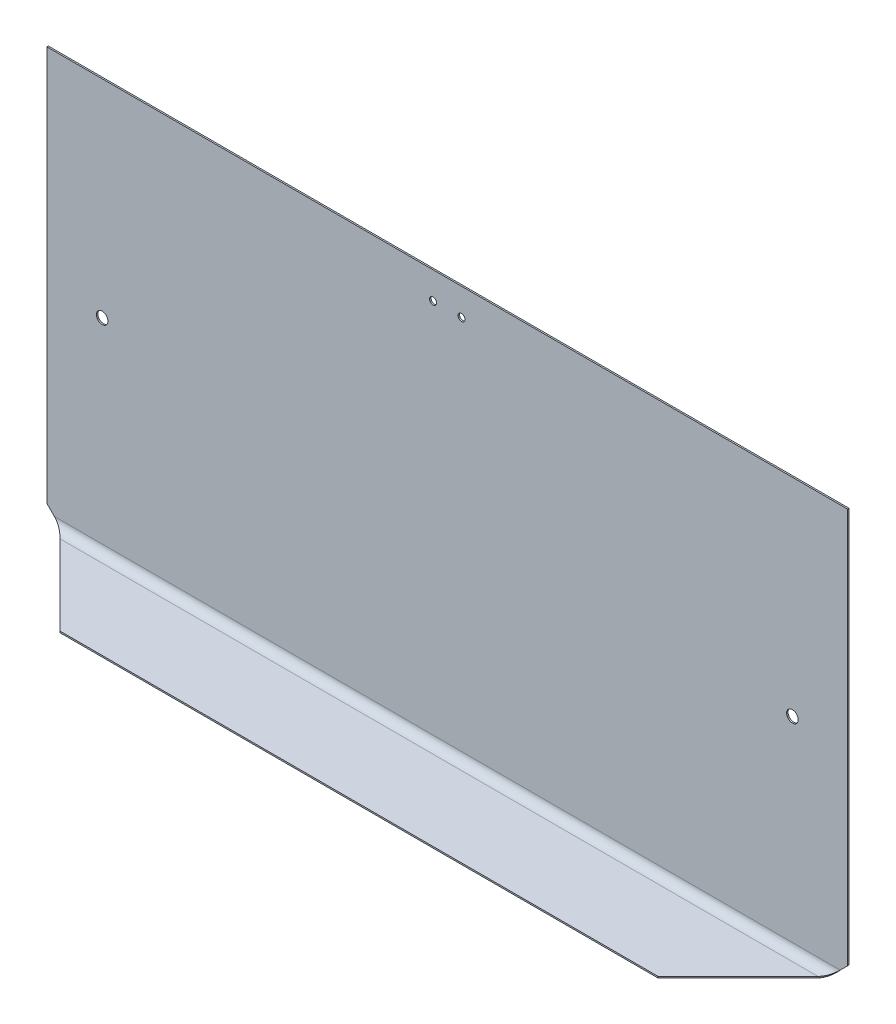
ISO-10303-21;
HEADER;
FILE_DESCRIPTION(('STEP AP214'),'2;1');
FILE_NAME('part.step','',(''),(''),'','','');
FILE_SCHEMA(('AUTOMOTIVE_DESIGN { 1 0 10303 214 1 1 1 1 }'));
ENDSEC;
DATA;
#1=APPLICATION_CONTEXT('core data for automotive mechanical design processes');
#2=APPLICATION_PROTOCOL_DEFINITION('international standard','automotive_design',2000,#1);
#3=PRODUCT_CONTEXT('',#1,'mechanical');
#4=PRODUCT('Part','Part','',(#3));
#5=PRODUCT_RELATED_PRODUCT_CATEGORY('part','',(#4));
#6=PRODUCT_DEFINITION_FORMATION('','',#4);
#7=PRODUCT_DEFINITION_CONTEXT('part definition',#1,'design');
#8=PRODUCT_DEFINITION('design','',#6,#7);
#9=PRODUCT_DEFINITION_SHAPE('','',#8);
#10=(LENGTH_UNIT() NAMED_UNIT(*) SI_UNIT(.MILLI.,.METRE.));
#11=(NAMED_UNIT(*) PLANE_ANGLE_UNIT() SI_UNIT($,.RADIAN.));
#12=(NAMED_UNIT(*) SI_UNIT($,.STERADIAN.) SOLID_ANGLE_UNIT());
#13=UNCERTAINTY_MEASURE_WITH_UNIT(LENGTH_MEASURE(1.E-05),#10,'distance_accuracy_value','');
#14=(GEOMETRIC_REPRESENTATION_CONTEXT(3) GLOBAL_UNCERTAINTY_ASSIGNED_CONTEXT((#13)) GLOBAL_UNIT_ASSIGNED_CONTEXT((#10,
#11,#12)) REPRESENTATION_CONTEXT('',''));
#15=CARTESIAN_POINT('',(0.,0.,0.));
#16=DIRECTION('',(0.,0.,1.));
#17=DIRECTION('',(1.,0.,0.));
#18=AXIS2_PLACEMENT_3D('',#15,#16,#17);
#19=CARTESIAN_POINT('',(145.,-58.9352822974256,-4.28615324153258));
#20=DIRECTION('',(0.707106781186539,0.,0.707106781186556));
#21=DIRECTION('',(0.707106781186556,0.,-0.707106781186539));
#22=AXIS2_PLACEMENT_3D('',#19,#20,#21);
#23=PLANE('',#22);
#24=DIRECTION('',(0.707106781186556,0.,-0.707106781186539));
#25=VECTOR('',#24,1.);
#26=CARTESIAN_POINT('',(145.,-59.4662822974256,-4.28615324153258));
#27=LINE('',#26,#25);
#28=CARTESIAN_POINT('',(108.247564461041,-59.4662822974255,32.4662822974255));
#29=VERTEX_POINT('',#28);
#30=CARTESIAN_POINT('',(137.182846758467,-59.4662822974256,3.53100000000001));
#31=VERTEX_POINT('',#30);
#32=EDGE_CURVE('E210',#29,#31,#27,.T.);
#33=ORIENTED_EDGE('',*,*,#32,.T.);
#34=CARTESIAN_POINT('',(137.182846758467,-58.9352822974256,3.53100000000001));
#35=CARTESIAN_POINT('',(137.182846758467,-59.4662822974256,3.53100000000001));
#36=B_SPLINE_CURVE_WITH_KNOTS('',1,(#34,#35),.UNSPECIFIED.,.F.,.F.,(2,2),(0.,1.),.UNSPECIFIED.);
#37=CARTESIAN_POINT('',(137.182846758467,-58.9352822974256,3.53100000000001));
#38=VERTEX_POINT('',#37);
#39=EDGE_CURVE('E164',#31,#38,#36,.F.);
#40=ORIENTED_EDGE('',*,*,#39,.T.);
#41=DIRECTION('',(0.707106781186556,0.,-0.707106781186539));
#42=VECTOR('',#41,1.);
#43=CARTESIAN_POINT('',(145.,-58.9352822974256,-4.28615324153258));
#44=LINE('',#43,#42);
#45=CARTESIAN_POINT('',(108.247564461041,-58.9352822974255,32.4662822974255));
#46=VERTEX_POINT('',#45);
#47=EDGE_CURVE('E271',#46,#38,#44,.T.);
#48=ORIENTED_EDGE('',*,*,#47,.F.);
#49=DIRECTION('',(0.,1.,0.));
#50=VECTOR('',#49,1.);
#51=CARTESIAN_POINT('',(108.247564461041,-58.9352822974255,32.4662822974255));
#52=LINE('',#51,#50);
#53=EDGE_CURVE('E91',#29,#46,#52,.T.);
#54=ORIENTED_EDGE('',*,*,#53,.F.);
#55=EDGE_LOOP('',(#33,#40,#48,#54));
#56=FACE_BOUND('',#55,.T.);
#57=ADVANCED_FACE('F62',(#56),#23,.T.);
#58=CARTESIAN_POINT('',(-145.,-58.9352822974256,-4.28615324153243));
#59=DIRECTION('',(-0.707106781186537,0.,0.707106781186558));
#60=DIRECTION('',(0.707106781186558,0.,0.707106781186537));
#61=AXIS2_PLACEMENT_3D('',#58,#59,#60);
#62=PLANE('',#61);
#63=DIRECTION('',(0.707106781186558,0.,0.707106781186537));
#64=VECTOR('',#63,1.);
#65=CARTESIAN_POINT('',(-145.,-58.9352822974256,-4.28615324153243));
#66=LINE('',#65,#64);
#67=CARTESIAN_POINT('',(-137.182846758467,-58.9352822974256,3.53100000000002));
#68=VERTEX_POINT('',#67);
#69=CARTESIAN_POINT('',(-108.247564461041,-58.9352822974255,32.4662822974256));
#70=VERTEX_POINT('',#69);
#71=EDGE_CURVE('E202',#68,#70,#66,.T.);
#72=ORIENTED_EDGE('',*,*,#71,.F.);
#73=CARTESIAN_POINT('',(-137.182846758467,-59.4662822974256,3.53100000000001));
#74=CARTESIAN_POINT('',(-137.182846758467,-58.9352822974256,3.53100000000001));
#75=B_SPLINE_CURVE_WITH_KNOTS('',1,(#73,#74),.UNSPECIFIED.,.F.,.F.,(2,2),(0.,1.),.UNSPECIFIED.);
#76=CARTESIAN_POINT('',(-137.182846758467,-59.4662822974256,3.53100000000001));
#77=VERTEX_POINT('',#76);
#78=EDGE_CURVE('E12',#68,#77,#75,.F.);
#79=ORIENTED_EDGE('',*,*,#78,.T.);
#80=DIRECTION('',(0.707106781186558,0.,0.707106781186537));
#81=VECTOR('',#80,1.);
#82=CARTESIAN_POINT('',(-145.,-59.4662822974256,-4.28615324153243));
#83=LINE('',#82,#81);
#84=CARTESIAN_POINT('',(-108.247564461041,-59.4662822974255,32.4662822974256));
#85=VERTEX_POINT('',#84);
#86=EDGE_CURVE('E104',#77,#85,#83,.T.);
#87=ORIENTED_EDGE('',*,*,#86,.T.);
#88=DIRECTION('',(0.,1.,0.));
#89=VECTOR('',#88,1.);
#90=CARTESIAN_POINT('',(-108.247564461041,-58.9352822974255,32.4662822974256));
#91=LINE('',#90,#89);
#92=EDGE_CURVE('E276',#85,#70,#91,.T.);
#93=ORIENTED_EDGE('',*,*,#92,.T.);
#94=EDGE_LOOP('',(#72,#79,#87,#93));
#95=FACE_BOUND('',#94,.T.);
#96=ADVANCED_FACE('F64',(#95),#62,.T.);
#97=CARTESIAN_POINT('',(0.,-58.9352822974258,-57.5337177025743));
#98=DIRECTION('',(0.,1.,0.));
#99=DIRECTION('',(1.,0.,0.));
#100=AXIS2_PLACEMENT_3D('',#97,#98,#99);
#101=PLANE('',#100);
#102=ORIENTED_EDGE('',*,*,#47,.T.);
#103=DIRECTION('',(-1.,0.,0.));
#104=VECTOR('',#103,1.);
#105=CARTESIAN_POINT('',(0.,-58.9352822974256,3.53100000000002));
#106=LINE('',#105,#104);
#107=EDGE_CURVE('E279',#38,#68,#106,.T.);
#108=ORIENTED_EDGE('',*,*,#107,.T.);
#109=ORIENTED_EDGE('',*,*,#71,.T.);
#110=DIRECTION('',(1.,0.,0.));
#111=VECTOR('',#110,1.);
#112=CARTESIAN_POINT('',(-108.247564461041,-58.9352822974255,32.4662822974256));
#113=LINE('',#112,#111);
#114=EDGE_CURVE('E268',#70,#46,#113,.T.);
#115=ORIENTED_EDGE('',*,*,#114,.T.);
#116=EDGE_LOOP('',(#102,#108,#109,#115));
#117=FACE_BOUND('',#116,.T.);
#118=ADVANCED_FACE('F227',(#117),#101,.T.);
#119=CARTESIAN_POINT('',(-108.247564461041,-58.9352822974255,32.4662822974256));
#120=DIRECTION('',(0.,0.,1.));
#121=DIRECTION('',(1.,0.,0.));
#122=AXIS2_PLACEMENT_3D('',#119,#120,#121);
#123=PLANE('',#122);
#124=ORIENTED_EDGE('',*,*,#92,.F.);
#125=DIRECTION('',(1.,0.,0.));
#126=VECTOR('',#125,1.);
#127=CARTESIAN_POINT('',(0.,-59.4662822974255,32.4662822974256));
#128=LINE('',#127,#126);
#129=EDGE_CURVE('E197',#85,#29,#128,.T.);
#130=ORIENTED_EDGE('',*,*,#129,.T.);
#131=ORIENTED_EDGE('',*,*,#53,.T.);
#132=ORIENTED_EDGE('',*,*,#114,.F.);
#133=EDGE_LOOP('',(#124,#130,#131,#132));
#134=FACE_BOUND('',#133,.T.);
#135=ADVANCED_FACE('F231',(#134),#123,.T.);
#136=CARTESIAN_POINT('',(0.,-59.4662822974258,-57.5337177025743));
#137=DIRECTION('',(0.,1.,0.));
#138=DIRECTION('',(1.,0.,0.));
#139=AXIS2_PLACEMENT_3D('',#136,#137,#138);
#140=PLANE('',#139);
#141=DIRECTION('',(-1.,0.,0.));
#142=VECTOR('',#141,1.);
#143=CARTESIAN_POINT('',(0.,-59.4662822974256,3.53100000000001));
#144=LINE('',#143,#142);
#145=EDGE_CURVE('E74',#31,#77,#144,.T.);
#146=ORIENTED_EDGE('',*,*,#145,.F.);
#147=ORIENTED_EDGE('',*,*,#32,.F.);
#148=ORIENTED_EDGE('',*,*,#129,.F.);
#149=ORIENTED_EDGE('',*,*,#86,.F.);
#150=EDGE_LOOP('',(#146,#147,#148,#149));
#151=FACE_BOUND('',#150,.T.);
#152=ADVANCED_FACE('F196',(#151),#140,.F.);
#153=CARTESIAN_POINT('',(-145.,90.,0.531));
#154=DIRECTION('',(-1.,0.,0.));
#155=DIRECTION('',(0.,-1.,0.));
#156=AXIS2_PLACEMENT_3D('',#153,#154,#155);
#157=PLANE('',#156);
#158=DIRECTION('',(0.,0.,1.));
#159=VECTOR('',#158,1.);
#160=CARTESIAN_POINT('',(-145.,90.,0.531));
#161=LINE('',#160,#159);
#162=CARTESIAN_POINT('',(-145.,90.,0.));
#163=VERTEX_POINT('',#162);
#164=CARTESIAN_POINT('',(-145.,90.,0.531));
#165=VERTEX_POINT('',#164);
#166=EDGE_CURVE('E447',#163,#165,#161,.T.);
#167=ORIENTED_EDGE('',*,*,#166,.F.);
#168=DIRECTION('',(0.,1.,0.));
#169=VECTOR('',#168,1.);
#170=CARTESIAN_POINT('',(-145.,0.,0.));
#171=LINE('',#170,#169);
#172=CARTESIAN_POINT('',(-145.,-53.2475644610419,0.));
#173=VERTEX_POINT('',#172);
#174=EDGE_CURVE('E331',#163,#173,#171,.F.);
#175=ORIENTED_EDGE('',*,*,#174,.T.);
#176=DIRECTION('',(0.,0.,1.));
#177=VECTOR('',#176,1.);
#178=CARTESIAN_POINT('',(-145.,-53.2475644610419,0.531));
#179=LINE('',#178,#177);
#180=CARTESIAN_POINT('',(-145.,-53.2475644610419,0.531));
#181=VERTEX_POINT('',#180);
#182=EDGE_CURVE('E113',#173,#181,#179,.T.);
#183=ORIENTED_EDGE('',*,*,#182,.T.);
#184=DIRECTION('',(0.,-1.,0.));
#185=VECTOR('',#184,1.);
#186=CARTESIAN_POINT('',(-145.,90.,0.531));
#187=LINE('',#186,#185);
#188=EDGE_CURVE('E265',#165,#181,#187,.T.);
#189=ORIENTED_EDGE('',*,*,#188,.F.);
#190=EDGE_LOOP('',(#167,#175,#183,#189));
#191=FACE_BOUND('',#190,.T.);
#192=ADVANCED_FACE('F230',(#191),#157,.T.);
#193=CARTESIAN_POINT('',(-145.,90.,0.531));
#194=DIRECTION('',(0.,1.,0.));
#195=DIRECTION('',(-1.,0.,0.));
#196=AXIS2_PLACEMENT_3D('',#193,#194,#195);
#197=PLANE('',#196);
#198=DIRECTION('',(0.,0.,1.));
#199=VECTOR('',#198,1.);
#200=CARTESIAN_POINT('',(145.,90.,0.531));
#201=LINE('',#200,#199);
#202=CARTESIAN_POINT('',(145.,90.,0.));
#203=VERTEX_POINT('',#202);
#204=CARTESIAN_POINT('',(145.,90.,0.531));
#205=VERTEX_POINT('',#204);
#206=EDGE_CURVE('E440',#203,#205,#201,.T.);
#207=ORIENTED_EDGE('',*,*,#206,.F.);
#208=DIRECTION('',(1.,0.,0.));
#209=VECTOR('',#208,1.);
#210=CARTESIAN_POINT('',(0.,90.,0.));
#211=LINE('',#210,#209);
#212=EDGE_CURVE('E450',#203,#163,#211,.F.);
#213=ORIENTED_EDGE('',*,*,#212,.T.);
#214=ORIENTED_EDGE('',*,*,#166,.T.);
#215=DIRECTION('',(-1.,0.,0.));
#216=VECTOR('',#215,1.);
#217=CARTESIAN_POINT('',(-145.,90.,0.531));
#218=LINE('',#217,#216);
#219=EDGE_CURVE('E309',#205,#165,#218,.T.);
#220=ORIENTED_EDGE('',*,*,#219,.F.);
#221=EDGE_LOOP('',(#207,#213,#214,#220));
#222=FACE_BOUND('',#221,.T.);
#223=ADVANCED_FACE('F236',(#222),#197,.T.);
#224=CARTESIAN_POINT('',(145.,90.,0.531));
#225=DIRECTION('',(1.,0.,0.));
#226=DIRECTION('',(0.,1.,0.));
#227=AXIS2_PLACEMENT_3D('',#224,#225,#226);
#228=PLANE('',#227);
#229=DIRECTION('',(0.,0.,1.));
#230=VECTOR('',#229,1.);
#231=CARTESIAN_POINT('',(145.,-53.2475644610417,0.531));
#232=LINE('',#231,#230);
#233=CARTESIAN_POINT('',(145.,-53.2475644610417,0.));
#234=VERTEX_POINT('',#233);
#235=CARTESIAN_POINT('',(145.,-53.2475644610417,0.531));
#236=VERTEX_POINT('',#235);
#237=EDGE_CURVE('E431',#234,#236,#232,.T.);
#238=ORIENTED_EDGE('',*,*,#237,.F.);
#239=DIRECTION('',(0.,1.,0.));
#240=VECTOR('',#239,1.);
#241=CARTESIAN_POINT('',(145.,0.,0.));
#242=LINE('',#241,#240);
#243=EDGE_CURVE('E443',#234,#203,#242,.T.);
#244=ORIENTED_EDGE('',*,*,#243,.T.);
#245=ORIENTED_EDGE('',*,*,#206,.T.);
#246=DIRECTION('',(0.,1.,0.));
#247=VECTOR('',#246,1.);
#248=CARTESIAN_POINT('',(145.,90.,0.531));
#249=LINE('',#248,#247);
#250=EDGE_CURVE('E307',#236,#205,#249,.T.);
#251=ORIENTED_EDGE('',*,*,#250,.F.);
#252=EDGE_LOOP('',(#238,#244,#245,#251));
#253=FACE_BOUND('',#252,.T.);
#254=ADVANCED_FACE('F484',(#253),#228,.T.);
#255=CARTESIAN_POINT('',(0.,0.,0.531));
#256=DIRECTION('',(0.,0.,1.));
#257=DIRECTION('',(1.,0.,0.));
#258=AXIS2_PLACEMENT_3D('',#255,#256,#257);
#259=PLANE('',#258);
#260=CARTESIAN_POINT('',(5.15,80.2,0.531));
#261=DIRECTION('',(0.,0.,1.));
#262=DIRECTION('',(1.,0.,0.));
#263=AXIS2_PLACEMENT_3D('',#260,#261,#262);
#264=CIRCLE('',#263,1.25);
#265=CARTESIAN_POINT('',(6.4,80.2,0.531));
#266=VERTEX_POINT('',#265);
#267=EDGE_CURVE('E304',#266,#266,#264,.T.);
#268=ORIENTED_EDGE('',*,*,#267,.F.);
#269=EDGE_LOOP('',(#268));
#270=FACE_BOUND('',#269,.T.);
#271=CARTESIAN_POINT('',(-5.14999999999999,80.2,0.531));
#272=DIRECTION('',(0.,0.,1.));
#273=DIRECTION('',(1.,0.,0.));
#274=AXIS2_PLACEMENT_3D('',#271,#272,#273);
#275=CIRCLE('',#274,1.25);
#276=CARTESIAN_POINT('',(-3.89999999999999,80.2,0.531));
#277=VERTEX_POINT('',#276);
#278=EDGE_CURVE('E301',#277,#277,#275,.T.);
#279=ORIENTED_EDGE('',*,*,#278,.F.);
#280=EDGE_LOOP('',(#279));
#281=FACE_BOUND('',#280,.T.);
#282=CARTESIAN_POINT('',(125.,15.,0.531));
#283=DIRECTION('',(0.,0.,1.));
#284=DIRECTION('',(1.,0.,0.));
#285=AXIS2_PLACEMENT_3D('',#282,#283,#284);
#286=CIRCLE('',#285,2.1);
#287=CARTESIAN_POINT('',(127.1,15.,0.531));
#288=VERTEX_POINT('',#287);
#289=EDGE_CURVE('E320',#288,#288,#286,.T.);
#290=ORIENTED_EDGE('',*,*,#289,.F.);
#291=EDGE_LOOP('',(#290));
#292=FACE_BOUND('',#291,.T.);
#293=CARTESIAN_POINT('',(-125.,15.,0.531));
#294=DIRECTION('',(0.,0.,1.));
#295=DIRECTION('',(1.,0.,0.));
#296=AXIS2_PLACEMENT_3D('',#293,#294,#295);
#297=CIRCLE('',#296,2.1);
#298=CARTESIAN_POINT('',(-122.9,15.,0.531));
#299=VERTEX_POINT('',#298);
#300=EDGE_CURVE('E344',#299,#299,#297,.T.);
#301=ORIENTED_EDGE('',*,*,#300,.F.);
#302=EDGE_LOOP('',(#301));
#303=FACE_BOUND('',#302,.T.);
#304=DIRECTION('',(-1.,0.,0.));
#305=VECTOR('',#304,1.);
#306=CARTESIAN_POINT('',(0.,-55.9352822974256,0.531));
#307=LINE('',#306,#305);
#308=CARTESIAN_POINT('',(142.312282163616,-55.9352822974256,0.531));
#309=VERTEX_POINT('',#308);
#310=CARTESIAN_POINT('',(-142.312282163616,-55.9352822974256,0.531));
#311=VERTEX_POINT('',#310);
#312=EDGE_CURVE('E314',#309,#311,#307,.T.);
#313=ORIENTED_EDGE('',*,*,#312,.F.);
#314=DIRECTION('',(0.707106781186556,0.707106781186539,0.));
#315=VECTOR('',#314,1.);
#316=CARTESIAN_POINT('',(145.,-53.2475644610417,0.531));
#317=LINE('',#316,#315);
#318=EDGE_CURVE('E156',#309,#236,#317,.T.);
#319=ORIENTED_EDGE('',*,*,#318,.T.);
#320=ORIENTED_EDGE('',*,*,#250,.T.);
#321=ORIENTED_EDGE('',*,*,#219,.T.);
#322=ORIENTED_EDGE('',*,*,#188,.T.);
#323=DIRECTION('',(0.707106781186558,-0.707106781186537,0.));
#324=VECTOR('',#323,1.);
#325=CARTESIAN_POINT('',(-145.,-53.2475644610419,0.531));
#326=LINE('',#325,#324);
#327=EDGE_CURVE('E148',#181,#311,#326,.T.);
#328=ORIENTED_EDGE('',*,*,#327,.T.);
#329=EDGE_LOOP('',(#313,#319,#320,#321,#322,#328));
#330=FACE_BOUND('',#329,.T.);
#331=ADVANCED_FACE('F481',(#270,#281,#292,#303,#330),#259,.T.);
#332=CARTESIAN_POINT('',(145.,-53.2475644610417,0.531));
#333=DIRECTION('',(0.707106781186539,-0.707106781186556,0.));
#334=DIRECTION('',(0.707106781186556,0.707106781186539,0.));
#335=AXIS2_PLACEMENT_3D('',#332,#333,#334);
#336=PLANE('',#335);
#337=CARTESIAN_POINT('',(142.312282163616,-55.9352822974256,0.));
#338=CARTESIAN_POINT('',(142.312282163616,-55.9352822974256,0.531));
#339=B_SPLINE_CURVE_WITH_KNOTS('',1,(#337,#338),.UNSPECIFIED.,.F.,.F.,(2,2),(0.,1.),.UNSPECIFIED.);
#340=CARTESIAN_POINT('',(142.312282163616,-55.9352822974256,0.));
#341=VERTEX_POINT('',#340);
#342=EDGE_CURVE('E313',#341,#309,#339,.T.);
#343=ORIENTED_EDGE('',*,*,#342,.F.);
#344=DIRECTION('',(0.707106781186556,0.707106781186539,0.));
#345=VECTOR('',#344,1.);
#346=CARTESIAN_POINT('',(145.,-53.2475644610417,0.));
#347=LINE('',#346,#345);
#348=EDGE_CURVE('E264',#341,#234,#347,.T.);
#349=ORIENTED_EDGE('',*,*,#348,.T.);
#350=ORIENTED_EDGE('',*,*,#237,.T.);
#351=ORIENTED_EDGE('',*,*,#318,.F.);
#352=EDGE_LOOP('',(#343,#349,#350,#351));
#353=FACE_BOUND('',#352,.T.);
#354=ADVANCED_FACE('F472',(#353),#336,.T.);
#355=CARTESIAN_POINT('',(0.,0.,0.));
#356=DIRECTION('',(0.,0.,1.));
#357=DIRECTION('',(1.,0.,0.));
#358=AXIS2_PLACEMENT_3D('',#355,#356,#357);
#359=PLANE('',#358);
#360=CARTESIAN_POINT('',(5.15,80.2,0.));
#361=DIRECTION('',(0.,0.,-1.));
#362=DIRECTION('',(-1.,0.,0.));
#363=AXIS2_PLACEMENT_3D('',#360,#361,#362);
#364=CIRCLE('',#363,1.25);
#365=CARTESIAN_POINT('',(3.9,80.2,0.));
#366=VERTEX_POINT('',#365);
#367=EDGE_CURVE('E305',#366,#366,#364,.T.);
#368=ORIENTED_EDGE('',*,*,#367,.F.);
#369=EDGE_LOOP('',(#368));
#370=FACE_BOUND('',#369,.T.);
#371=CARTESIAN_POINT('',(-5.14999999999999,80.2,0.));
#372=DIRECTION('',(0.,0.,-1.));
#373=DIRECTION('',(-1.,0.,0.));
#374=AXIS2_PLACEMENT_3D('',#371,#372,#373);
#375=CIRCLE('',#374,1.25);
#376=CARTESIAN_POINT('',(-6.39999999999999,80.2,0.));
#377=VERTEX_POINT('',#376);
#378=EDGE_CURVE('E315',#377,#377,#375,.T.);
#379=ORIENTED_EDGE('',*,*,#378,.F.);
#380=EDGE_LOOP('',(#379));
#381=FACE_BOUND('',#380,.T.);
#382=CARTESIAN_POINT('',(125.,15.,0.));
#383=DIRECTION('',(0.,0.,-1.));
#384=DIRECTION('',(-1.,0.,0.));
#385=AXIS2_PLACEMENT_3D('',#382,#383,#384);
#386=CIRCLE('',#385,2.1);
#387=CARTESIAN_POINT('',(122.9,15.,0.));
#388=VERTEX_POINT('',#387);
#389=EDGE_CURVE('E327',#388,#388,#386,.T.);
#390=ORIENTED_EDGE('',*,*,#389,.F.);
#391=EDGE_LOOP('',(#390));
#392=FACE_BOUND('',#391,.T.);
#393=CARTESIAN_POINT('',(-125.,15.,0.));
#394=DIRECTION('',(0.,0.,-1.));
#395=DIRECTION('',(1.,0.,0.));
#396=AXIS2_PLACEMENT_3D('',#393,#394,#395);
#397=CIRCLE('',#396,2.1);
#398=CARTESIAN_POINT('',(-122.9,15.,0.));
#399=VERTEX_POINT('',#398);
#400=EDGE_CURVE('E324',#399,#399,#397,.T.);
#401=ORIENTED_EDGE('',*,*,#400,.F.);
#402=EDGE_LOOP('',(#401));
#403=FACE_BOUND('',#402,.T.);
#404=ORIENTED_EDGE('',*,*,#348,.F.);
#405=DIRECTION('',(-1.,0.,0.));
#406=VECTOR('',#405,1.);
#407=CARTESIAN_POINT('',(0.,-55.9352822974256,0.));
#408=LINE('',#407,#406);
#409=CARTESIAN_POINT('',(-142.312282163616,-55.9352822974256,0.));
#410=VERTEX_POINT('',#409);
#411=EDGE_CURVE('E438',#341,#410,#408,.T.);
#412=ORIENTED_EDGE('',*,*,#411,.T.);
#413=DIRECTION('',(0.707106781186558,-0.707106781186537,0.));
#414=VECTOR('',#413,1.);
#415=CARTESIAN_POINT('',(-145.,-53.2475644610419,0.));
#416=LINE('',#415,#414);
#417=EDGE_CURVE('E199',#173,#410,#416,.T.);
#418=ORIENTED_EDGE('',*,*,#417,.F.);
#419=ORIENTED_EDGE('',*,*,#174,.F.);
#420=ORIENTED_EDGE('',*,*,#212,.F.);
#421=ORIENTED_EDGE('',*,*,#243,.F.);
#422=EDGE_LOOP('',(#404,#412,#418,#419,#420,#421));
#423=FACE_BOUND('',#422,.T.);
#424=ADVANCED_FACE('F249',(#370,#381,#392,#403,#423),#359,.F.);
#425=CARTESIAN_POINT('',(-145.,-53.2475644610419,0.531));
#426=DIRECTION('',(-0.707106781186537,-0.707106781186558,0.));
#427=DIRECTION('',(0.707106781186558,-0.707106781186537,0.));
#428=AXIS2_PLACEMENT_3D('',#425,#426,#427);
#429=PLANE('',#428);
#430=CARTESIAN_POINT('',(-142.312282163616,-55.9352822974256,0.531));
#431=CARTESIAN_POINT('',(-142.312282163616,-55.9352822974256,0.));
#432=B_SPLINE_CURVE_WITH_KNOTS('',1,(#430,#431),.UNSPECIFIED.,.F.,.F.,(2,2),(0.,1.),.UNSPECIFIED.);
#433=EDGE_CURVE('E189',#311,#410,#432,.T.);
#434=ORIENTED_EDGE('',*,*,#433,.F.);
#435=ORIENTED_EDGE('',*,*,#327,.F.);
#436=ORIENTED_EDGE('',*,*,#182,.F.);
#437=ORIENTED_EDGE('',*,*,#417,.T.);
#438=EDGE_LOOP('',(#434,#435,#436,#437));
#439=FACE_BOUND('',#438,.T.);
#440=ADVANCED_FACE('F244',(#439),#429,.T.);
#441=CARTESIAN_POINT('',(137.182846758467,-59.4662822974256,3.53100000000001));
#442=CARTESIAN_POINT('',(137.610341249236,-59.4662822974256,3.06874826308267));
#443=CARTESIAN_POINT('',(138.037752659325,-59.3743798187414,2.60676822032739));
#444=CARTESIAN_POINT('',(138.892658560184,-59.0206220347045,1.75272138031036));
#445=CARTESIAN_POINT('',(139.320111510613,-58.7589059179336,1.36103553176858));
#446=CARTESIAN_POINT('',(140.175017411471,-58.105246765657,0.707376379492029));
#447=CARTESIAN_POINT('',(140.6024703619,-57.7135609171152,0.445660262721117));
#448=CARTESIAN_POINT('',(141.457376262758,-56.8595140770982,0.0919024786841782));
#449=CARTESIAN_POINT('',(141.884787672848,-56.3975340343429,0.));
#450=CARTESIAN_POINT('',(142.312282163616,-55.9352822974256,0.));
#451=CARTESIAN_POINT('',(137.182846758467,-58.9352822974256,3.53100000000001));
#452=CARTESIAN_POINT('',(137.610334983276,-58.9352822974256,3.13826851188882));
#453=CARTESIAN_POINT('',(138.037752659325,-58.8572003274305,2.74575634692216));
#454=CARTESIAN_POINT('',(138.892658560184,-58.5566414624884,2.02014305888731));
#455=CARTESIAN_POINT('',(139.320111510613,-58.3342828246201,1.68735984007526));
#456=CARTESIAN_POINT('',(140.175017411471,-57.7789224573503,1.13199947280546));
#457=CARTESIAN_POINT('',(140.6024703619,-57.4461392385383,0.909640834937228));
#458=CARTESIAN_POINT('',(141.457376262758,-56.7205259505034,0.609081969995054));
#459=CARTESIAN_POINT('',(141.884793938807,-56.3280137855368,0.531000000000001));
#460=CARTESIAN_POINT('',(142.312282163616,-55.9352822974256,0.531));
#461=B_SPLINE_SURFACE_WITH_KNOTS('',1,3,((#441,#442,#443,#444,#445,#446,#447,#448,#449,#450),
(#451,#452,#453,#454,#455,#456,#457,#458,#459,#460)),.UNSPECIFIED.,.F.,.F.,.F.,(2,2),(4,2,2,2,
4),(0.,1.),(0.,0.25,0.5,0.75,1.),.UNSPECIFIED.);
#462=CARTESIAN_POINT('',(137.182846758467,-59.4662822974256,3.53100000000001));
#463=CARTESIAN_POINT('',(137.610341249236,-59.4662822974256,3.06874826308267));
#464=CARTESIAN_POINT('',(138.037752659325,-59.3743798187414,2.60676822032739));
#465=CARTESIAN_POINT('',(138.892658560184,-59.0206220347045,1.75272138031036));
#466=CARTESIAN_POINT('',(139.320111510613,-58.7589059179336,1.36103553176858));
#467=CARTESIAN_POINT('',(140.175017411471,-58.105246765657,0.707376379492029));
#468=CARTESIAN_POINT('',(140.6024703619,-57.7135609171152,0.445660262721117));
#469=CARTESIAN_POINT('',(141.457376262758,-56.8595140770982,0.0919024786841782));
#470=CARTESIAN_POINT('',(141.884787672848,-56.3975340343429,0.));
#471=CARTESIAN_POINT('',(142.312282163616,-55.9352822974256,0.));
#472=B_SPLINE_CURVE_WITH_KNOTS('',3,(#462,#463,#464,#465,#466,#467,#468,#469,#470,#471),
.UNSPECIFIED.,.F.,.F.,(4,2,2,2,4),(0.,0.25,0.5,0.75,1.),.UNSPECIFIED.);
#473=EDGE_CURVE('E176',#31,#341,#472,.T.);
#474=CARTESIAN_POINT('',(142.312282163616,-55.9352822974256,0.531));
#475=CARTESIAN_POINT('',(141.884793938807,-56.3280137855368,0.531000000000001));
#476=CARTESIAN_POINT('',(141.457376262758,-56.7205259505034,0.609081969995054));
#477=CARTESIAN_POINT('',(140.6024703619,-57.4461392385383,0.909640834937228));
#478=CARTESIAN_POINT('',(140.175017411471,-57.7789224573503,1.13199947280546));
#479=CARTESIAN_POINT('',(139.320111510613,-58.3342828246201,1.68735984007526));
#480=CARTESIAN_POINT('',(138.892658560184,-58.5566414624884,2.02014305888731));
#481=CARTESIAN_POINT('',(138.037752659325,-58.8572003274305,2.74575634692216));
#482=CARTESIAN_POINT('',(137.610334983276,-58.9352822974256,3.13826851188882));
#483=CARTESIAN_POINT('',(137.182846758467,-58.9352822974256,3.53100000000001));
#484=B_SPLINE_CURVE_WITH_KNOTS('',3,(#474,#475,#476,#477,#478,#479,#480,#481,#482,#483),
.UNSPECIFIED.,.F.,.F.,(4,2,2,2,4),(0.,0.25,0.5,0.75,1.),.UNSPECIFIED.);
#485=EDGE_CURVE('E192',#38,#309,#484,.F.);
#486=ORIENTED_EDGE('',*,*,#39,.F.);
#487=ORIENTED_EDGE('',*,*,#473,.T.);
#488=ORIENTED_EDGE('',*,*,#342,.T.);
#489=ORIENTED_EDGE('',*,*,#485,.F.);
#490=EDGE_LOOP('',(#486,#487,#488,#489));
#491=FACE_BOUND('',#490,.T.);
#492=ADVANCED_FACE('F248',(#491),#461,.F.);
#493=CARTESIAN_POINT('',(-142.312282163616,-55.9352822974256,0.));
#494=CARTESIAN_POINT('',(-141.884787672848,-56.3975340343429,0.));
#495=CARTESIAN_POINT('',(-141.457376262758,-56.8595140770982,0.0919024786841787));
#496=CARTESIAN_POINT('',(-140.6024703619,-57.7135609171152,0.445660262721119));
#497=CARTESIAN_POINT('',(-140.175017411471,-58.105246765657,0.707376379492031));
#498=CARTESIAN_POINT('',(-139.320111510613,-58.7589059179336,1.36103553176858));
#499=CARTESIAN_POINT('',(-138.892658560184,-59.0206220347045,1.75272138031036));
#500=CARTESIAN_POINT('',(-138.037752659325,-59.3743798187414,2.60676822032739));
#501=CARTESIAN_POINT('',(-137.610341249236,-59.4662822974256,3.06874826308268));
#502=CARTESIAN_POINT('',(-137.182846758467,-59.4662822974256,3.53100000000001));
#503=CARTESIAN_POINT('',(-142.312282163616,-55.9352822974256,0.531));
#504=CARTESIAN_POINT('',(-141.884793938807,-56.3280137855368,0.531000000000001));
#505=CARTESIAN_POINT('',(-141.457376262758,-56.7205259505034,0.609081969995054));
#506=CARTESIAN_POINT('',(-140.6024703619,-57.4461392385383,0.909640834937229));
#507=CARTESIAN_POINT('',(-140.175017411471,-57.7789224573503,1.13199947280546));
#508=CARTESIAN_POINT('',(-139.320111510613,-58.3342828246201,1.68735984007526));
#509=CARTESIAN_POINT('',(-138.892658560184,-58.5566414624884,2.02014305888731));
#510=CARTESIAN_POINT('',(-138.037752659325,-58.8572003274305,2.74575634692217));
#511=CARTESIAN_POINT('',(-137.610334983276,-58.9352822974256,3.13826851188878));
#512=CARTESIAN_POINT('',(-137.182846758467,-58.9352822974256,3.53100000000001));
#513=B_SPLINE_SURFACE_WITH_KNOTS('',1,3,((#493,#494,#495,#496,#497,#498,#499,#500,#501,#502),
(#503,#504,#505,#506,#507,#508,#509,#510,#511,#512)),.UNSPECIFIED.,.F.,.F.,.F.,(2,2),(4,2,2,2,
4),(0.,1.),(0.,0.25,0.5,0.75,1.),.UNSPECIFIED.);
#514=CARTESIAN_POINT('',(-142.312282163616,-55.9352822974256,0.));
#515=CARTESIAN_POINT('',(-141.884787672848,-56.3975340343429,0.));
#516=CARTESIAN_POINT('',(-141.457376262758,-56.8595140770982,0.0919024786841787));
#517=CARTESIAN_POINT('',(-140.6024703619,-57.7135609171152,0.445660262721119));
#518=CARTESIAN_POINT('',(-140.175017411471,-58.105246765657,0.707376379492031));
#519=CARTESIAN_POINT('',(-139.320111510613,-58.7589059179336,1.36103553176858));
#520=CARTESIAN_POINT('',(-138.892658560184,-59.0206220347045,1.75272138031036));
#521=CARTESIAN_POINT('',(-138.037752659325,-59.3743798187414,2.60676822032739));
#522=CARTESIAN_POINT('',(-137.610341249236,-59.4662822974256,3.06874826308268));
#523=CARTESIAN_POINT('',(-137.182846758467,-59.4662822974256,3.53100000000001));
#524=B_SPLINE_CURVE_WITH_KNOTS('',3,(#514,#515,#516,#517,#518,#519,#520,#521,#522,#523),
.UNSPECIFIED.,.F.,.F.,(4,2,2,2,4),(0.,0.25,0.5,0.75,1.),.UNSPECIFIED.);
#525=EDGE_CURVE('E174',#410,#77,#524,.T.);
#526=CARTESIAN_POINT('',(-137.182846758467,-58.9352822974256,3.53100000000001));
#527=CARTESIAN_POINT('',(-137.610334983276,-58.9352822974256,3.13826851188878));
#528=CARTESIAN_POINT('',(-138.037752659325,-58.8572003274305,2.74575634692217));
#529=CARTESIAN_POINT('',(-138.892658560184,-58.5566414624884,2.02014305888731));
#530=CARTESIAN_POINT('',(-139.320111510613,-58.3342828246201,1.68735984007526));
#531=CARTESIAN_POINT('',(-140.175017411471,-57.7789224573503,1.13199947280546));
#532=CARTESIAN_POINT('',(-140.6024703619,-57.4461392385383,0.909640834937229));
#533=CARTESIAN_POINT('',(-141.457376262758,-56.7205259505034,0.609081969995054));
#534=CARTESIAN_POINT('',(-141.884793938807,-56.3280137855368,0.531000000000001));
#535=CARTESIAN_POINT('',(-142.312282163616,-55.9352822974256,0.531));
#536=B_SPLINE_CURVE_WITH_KNOTS('',3,(#526,#527,#528,#529,#530,#531,#532,#533,#534,#535),
.UNSPECIFIED.,.F.,.F.,(4,2,2,2,4),(0.,0.25,0.5,0.75,1.),.UNSPECIFIED.);
#537=EDGE_CURVE('E81',#311,#68,#536,.F.);
#538=ORIENTED_EDGE('',*,*,#525,.T.);
#539=ORIENTED_EDGE('',*,*,#78,.F.);
#540=ORIENTED_EDGE('',*,*,#537,.F.);
#541=ORIENTED_EDGE('',*,*,#433,.T.);
#542=EDGE_LOOP('',(#538,#539,#540,#541));
#543=FACE_BOUND('',#542,.T.);
#544=ADVANCED_FACE('F186',(#543),#513,.F.);
#545=CARTESIAN_POINT('',(-284.671276540227,-55.9352822974256,3.531));
#546=DIRECTION('',(1.,0.,0.));
#547=DIRECTION('',(0.,1.,0.));
#548=AXIS2_PLACEMENT_3D('',#545,#546,#547);
#549=CYLINDRICAL_SURFACE('',#548,3.);
#550=ORIENTED_EDGE('',*,*,#312,.T.);
#551=ORIENTED_EDGE('',*,*,#537,.T.);
#552=ORIENTED_EDGE('',*,*,#107,.F.);
#553=ORIENTED_EDGE('',*,*,#485,.T.);
#554=EDGE_LOOP('',(#550,#551,#552,#553));
#555=FACE_BOUND('',#554,.T.);
#556=ADVANCED_FACE('F355',(#555),#549,.F.);
#557=CARTESIAN_POINT('',(-284.671276540227,-55.9352822974256,3.531));
#558=DIRECTION('',(1.,0.,0.));
#559=DIRECTION('',(0.,1.,0.));
#560=AXIS2_PLACEMENT_3D('',#557,#558,#559);
#561=CYLINDRICAL_SURFACE('',#560,3.531);
#562=ORIENTED_EDGE('',*,*,#411,.F.);
#563=ORIENTED_EDGE('',*,*,#473,.F.);
#564=ORIENTED_EDGE('',*,*,#145,.T.);
#565=ORIENTED_EDGE('',*,*,#525,.F.);
#566=EDGE_LOOP('',(#562,#563,#564,#565));
#567=FACE_BOUND('',#566,.T.);
#568=ADVANCED_FACE('F173',(#567),#561,.T.);
#569=CARTESIAN_POINT('',(-125.,15.,10.));
#570=DIRECTION('',(0.,0.,-1.));
#571=DIRECTION('',(-1.,0.,0.));
#572=AXIS2_PLACEMENT_3D('',#569,#570,#571);
#573=CYLINDRICAL_SURFACE('',#572,2.1);
#574=ORIENTED_EDGE('',*,*,#300,.T.);
#575=EDGE_LOOP('',(#574));
#576=FACE_BOUND('',#575,.T.);
#577=ORIENTED_EDGE('',*,*,#400,.T.);
#578=EDGE_LOOP('',(#577));
#579=FACE_BOUND('',#578,.T.);
#580=ADVANCED_FACE('F365',(#576,#579),#573,.F.);
#581=CARTESIAN_POINT('',(125.,15.,10.));
#582=DIRECTION('',(0.,0.,-1.));
#583=DIRECTION('',(-1.,0.,0.));
#584=AXIS2_PLACEMENT_3D('',#581,#582,#583);
#585=CYLINDRICAL_SURFACE('',#584,2.1);
#586=ORIENTED_EDGE('',*,*,#289,.T.);
#587=EDGE_LOOP('',(#586));
#588=FACE_BOUND('',#587,.T.);
#589=ORIENTED_EDGE('',*,*,#389,.T.);
#590=EDGE_LOOP('',(#589));
#591=FACE_BOUND('',#590,.T.);
#592=ADVANCED_FACE('F562',(#588,#591),#585,.F.);
#593=CARTESIAN_POINT('',(-5.14999999999999,80.2,10.));
#594=DIRECTION('',(0.,0.,-1.));
#595=DIRECTION('',(-1.,0.,0.));
#596=AXIS2_PLACEMENT_3D('',#593,#594,#595);
#597=CYLINDRICAL_SURFACE('',#596,1.25);
#598=ORIENTED_EDGE('',*,*,#278,.T.);
#599=EDGE_LOOP('',(#598));
#600=FACE_BOUND('',#599,.T.);
#601=ORIENTED_EDGE('',*,*,#378,.T.);
#602=EDGE_LOOP('',(#601));
#603=FACE_BOUND('',#602,.T.);
#604=ADVANCED_FACE('F568',(#600,#603),#597,.F.);
#605=CARTESIAN_POINT('',(5.15,80.2,10.));
#606=DIRECTION('',(0.,0.,-1.));
#607=DIRECTION('',(-1.,0.,0.));
#608=AXIS2_PLACEMENT_3D('',#605,#606,#607);
#609=CYLINDRICAL_SURFACE('',#608,1.25);
#610=ORIENTED_EDGE('',*,*,#267,.T.);
#611=EDGE_LOOP('',(#610));
#612=FACE_BOUND('',#611,.T.);
#613=ORIENTED_EDGE('',*,*,#367,.T.);
#614=EDGE_LOOP('',(#613));
#615=FACE_BOUND('',#614,.T.);
#616=ADVANCED_FACE('F574',(#612,#615),#609,.F.);
#617=CLOSED_SHELL('',(#57,#96,#118,#135,#152,#192,#223,#254,#331,#354,#424,#440,#492,#544,#556,
#568,#580,#592,#604,#616));
#618=MANIFOLD_SOLID_BREP('B2',#617);
#619=ADVANCED_BREP_SHAPE_REPRESENTATION('',(#18,#618),#14);
#620=SHAPE_DEFINITION_REPRESENTATION(#9,#619);
ENDSEC;
END-ISO-10303-21;
